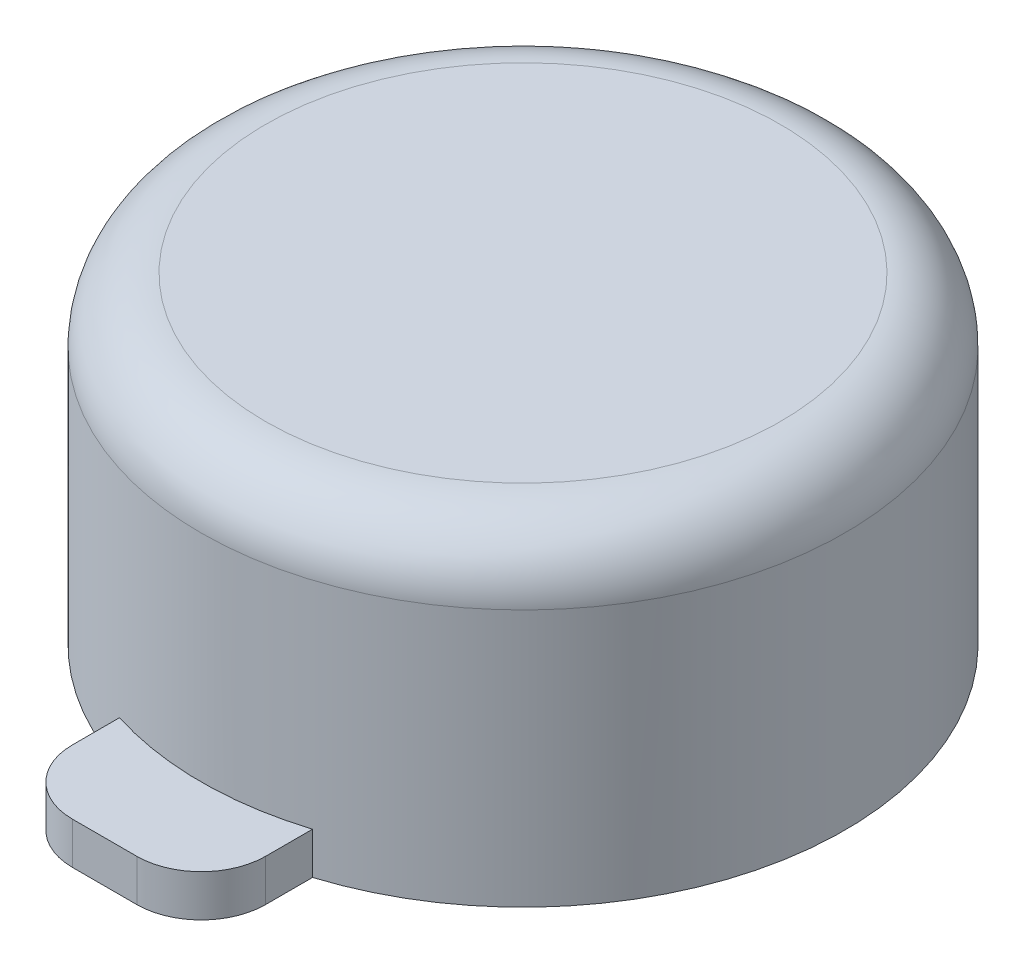
ISO-10303-21;
HEADER;
FILE_DESCRIPTION(('STEP AP214'),'2;1');
FILE_NAME('part.step','',(''),(''),'','','');
FILE_SCHEMA(('AUTOMOTIVE_DESIGN { 1 0 10303 214 1 1 1 1 }'));
ENDSEC;
DATA;
#1=APPLICATION_CONTEXT('core data for automotive mechanical design processes');
#2=APPLICATION_PROTOCOL_DEFINITION('international standard','automotive_design',2000,#1);
#3=PRODUCT_CONTEXT('',#1,'mechanical');
#4=PRODUCT('Part','Part','',(#3));
#5=PRODUCT_RELATED_PRODUCT_CATEGORY('part','',(#4));
#6=PRODUCT_DEFINITION_FORMATION('','',#4);
#7=PRODUCT_DEFINITION_CONTEXT('part definition',#1,'design');
#8=PRODUCT_DEFINITION('design','',#6,#7);
#9=PRODUCT_DEFINITION_SHAPE('','',#8);
#10=(LENGTH_UNIT() NAMED_UNIT(*) SI_UNIT(.MILLI.,.METRE.));
#11=(NAMED_UNIT(*) PLANE_ANGLE_UNIT() SI_UNIT($,.RADIAN.));
#12=(NAMED_UNIT(*) SI_UNIT($,.STERADIAN.) SOLID_ANGLE_UNIT());
#13=UNCERTAINTY_MEASURE_WITH_UNIT(LENGTH_MEASURE(1.E-05),#10,'distance_accuracy_value','');
#14=(GEOMETRIC_REPRESENTATION_CONTEXT(3) GLOBAL_UNCERTAINTY_ASSIGNED_CONTEXT((#13)) GLOBAL_UNIT_ASSIGNED_CONTEXT((#10,
#11,#12)) REPRESENTATION_CONTEXT('',''));
#15=CARTESIAN_POINT('',(0.,0.,0.));
#16=DIRECTION('',(0.,0.,1.));
#17=DIRECTION('',(1.,0.,0.));
#18=AXIS2_PLACEMENT_3D('',#15,#16,#17);
#19=CARTESIAN_POINT('',(0.,12.7,0.));
#20=DIRECTION('',(0.,-1.,0.));
#21=DIRECTION('',(0.,0.,-1.));
#22=AXIS2_PLACEMENT_3D('',#19,#20,#21);
#23=CYLINDRICAL_SURFACE('',#22,12.7);
#24=CARTESIAN_POINT('',(0.,10.16,0.));
#25=DIRECTION('',(0.,1.,0.));
#26=DIRECTION('',(0.,0.,1.));
#27=AXIS2_PLACEMENT_3D('',#24,#25,#26);
#28=CIRCLE('',#27,12.7);
#29=CARTESIAN_POINT('',(0.,10.16,12.7));
#30=VERTEX_POINT('',#29);
#31=EDGE_CURVE('E135',#30,#30,#28,.F.);
#32=ORIENTED_EDGE('',*,*,#31,.T.);
#33=EDGE_LOOP('',(#32));
#34=FACE_BOUND('',#33,.T.);
#35=CARTESIAN_POINT('',(0.,0.,0.));
#36=DIRECTION('',(0.,1.,0.));
#37=DIRECTION('',(0.,0.,1.));
#38=AXIS2_PLACEMENT_3D('',#35,#36,#37);
#39=CIRCLE('',#38,12.7);
#40=CARTESIAN_POINT('',(3.81,0.,12.1150278579952));
#41=VERTEX_POINT('',#40);
#42=CARTESIAN_POINT('',(-3.81,0.,12.1150278579952));
#43=VERTEX_POINT('',#42);
#44=EDGE_CURVE('E94',#41,#43,#39,.T.);
#45=ORIENTED_EDGE('',*,*,#44,.T.);
#46=DIRECTION('',(0.,-1.,0.));
#47=VECTOR('',#46,1.);
#48=CARTESIAN_POINT('',(-3.80999999999999,12.7,12.1150278579952));
#49=LINE('',#48,#47);
#50=CARTESIAN_POINT('',(-3.81,1.651,12.1150278579952));
#51=VERTEX_POINT('',#50);
#52=EDGE_CURVE('E160',#51,#43,#49,.T.);
#53=ORIENTED_EDGE('',*,*,#52,.F.);
#54=CARTESIAN_POINT('',(0.,1.651,0.));
#55=DIRECTION('',(0.,1.,0.));
#56=DIRECTION('',(0.,0.,1.));
#57=AXIS2_PLACEMENT_3D('',#54,#55,#56);
#58=CIRCLE('',#57,12.7);
#59=CARTESIAN_POINT('',(3.81,1.651,12.1150278579952));
#60=VERTEX_POINT('',#59);
#61=EDGE_CURVE('E110',#60,#51,#58,.F.);
#62=ORIENTED_EDGE('',*,*,#61,.F.);
#63=DIRECTION('',(0.,-1.,0.));
#64=VECTOR('',#63,1.);
#65=CARTESIAN_POINT('',(3.81,12.7,12.1150278579952));
#66=LINE('',#65,#64);
#67=EDGE_CURVE('E108',#41,#60,#66,.F.);
#68=ORIENTED_EDGE('',*,*,#67,.F.);
#69=EDGE_LOOP('',(#45,#53,#62,#68));
#70=FACE_BOUND('',#69,.T.);
#71=ADVANCED_FACE('F39',(#34,#70),#23,.T.);
#72=CARTESIAN_POINT('',(0.,12.7,0.));
#73=DIRECTION('',(0.,1.,0.));
#74=DIRECTION('',(0.,0.,1.));
#75=AXIS2_PLACEMENT_3D('',#72,#73,#74);
#76=PLANE('',#75);
#77=CARTESIAN_POINT('',(0.,12.7,0.));
#78=DIRECTION('',(0.,1.,0.));
#79=DIRECTION('',(0.,0.,1.));
#80=AXIS2_PLACEMENT_3D('',#77,#78,#79);
#81=CIRCLE('',#80,10.16);
#82=CARTESIAN_POINT('',(0.,12.7,10.16));
#83=VERTEX_POINT('',#82);
#84=EDGE_CURVE('E104',#83,#83,#81,.T.);
#85=ORIENTED_EDGE('',*,*,#84,.T.);
#86=EDGE_LOOP('',(#85));
#87=FACE_BOUND('',#86,.T.);
#88=ADVANCED_FACE('F170',(#87),#76,.T.);
#89=CARTESIAN_POINT('',(0.,0.,0.));
#90=DIRECTION('',(0.,1.,0.));
#91=DIRECTION('',(0.,0.,1.));
#92=AXIS2_PLACEMENT_3D('',#89,#90,#91);
#93=PLANE('',#92);
#94=CARTESIAN_POINT('',(0.,0.,0.));
#95=DIRECTION('',(0.,1.,0.));
#96=DIRECTION('',(0.,0.,1.));
#97=AXIS2_PLACEMENT_3D('',#94,#95,#96);
#98=CIRCLE('',#97,11.43);
#99=CARTESIAN_POINT('',(0.,0.,-11.43));
#100=VERTEX_POINT('',#99);
#101=EDGE_CURVE('E130',#100,#100,#98,.T.);
#102=ORIENTED_EDGE('',*,*,#101,.T.);
#103=EDGE_LOOP('',(#102));
#104=FACE_BOUND('',#103,.T.);
#105=DIRECTION('',(1.,0.,0.));
#106=VECTOR('',#105,1.);
#107=CARTESIAN_POINT('',(-3.81,0.,16.51));
#108=LINE('',#107,#106);
#109=CARTESIAN_POINT('',(-1.27,0.,16.51));
#110=VERTEX_POINT('',#109);
#111=CARTESIAN_POINT('',(1.27,0.,16.51));
#112=VERTEX_POINT('',#111);
#113=EDGE_CURVE('E117',#110,#112,#108,.T.);
#114=ORIENTED_EDGE('',*,*,#113,.F.);
#115=CARTESIAN_POINT('',(-1.27,0.,13.97));
#116=DIRECTION('',(0.,1.,0.));
#117=DIRECTION('',(0.,0.,1.));
#118=AXIS2_PLACEMENT_3D('',#115,#116,#117);
#119=CIRCLE('',#118,2.54);
#120=CARTESIAN_POINT('',(-3.81,0.,13.97));
#121=VERTEX_POINT('',#120);
#122=EDGE_CURVE('E146',#110,#121,#119,.F.);
#123=ORIENTED_EDGE('',*,*,#122,.T.);
#124=DIRECTION('',(0.,0.,1.));
#125=VECTOR('',#124,1.);
#126=CARTESIAN_POINT('',(-3.81,0.,-12.701));
#127=LINE('',#126,#125);
#128=EDGE_CURVE('E101',#43,#121,#127,.T.);
#129=ORIENTED_EDGE('',*,*,#128,.F.);
#130=ORIENTED_EDGE('',*,*,#44,.F.);
#131=DIRECTION('',(0.,0.,1.));
#132=VECTOR('',#131,1.);
#133=CARTESIAN_POINT('',(3.81,0.,-12.701));
#134=LINE('',#133,#132);
#135=CARTESIAN_POINT('',(3.81,0.,13.97));
#136=VERTEX_POINT('',#135);
#137=EDGE_CURVE('E99',#41,#136,#134,.T.);
#138=ORIENTED_EDGE('',*,*,#137,.T.);
#139=CARTESIAN_POINT('',(1.27,0.,13.97));
#140=DIRECTION('',(0.,1.,0.));
#141=DIRECTION('',(0.,0.,1.));
#142=AXIS2_PLACEMENT_3D('',#139,#140,#141);
#143=CIRCLE('',#142,2.54);
#144=EDGE_CURVE('E144',#136,#112,#143,.F.);
#145=ORIENTED_EDGE('',*,*,#144,.T.);
#146=EDGE_LOOP('',(#114,#123,#129,#130,#138,#145));
#147=FACE_BOUND('',#146,.T.);
#148=ADVANCED_FACE('F97',(#104,#147),#93,.F.);
#149=CARTESIAN_POINT('',(0.,10.16,0.));
#150=DIRECTION('',(0.,1.,0.));
#151=DIRECTION('',(0.,0.,1.));
#152=AXIS2_PLACEMENT_3D('',#149,#150,#151);
#153=TOROIDAL_SURFACE('',#152,10.16,2.54);
#154=ORIENTED_EDGE('',*,*,#31,.F.);
#155=EDGE_LOOP('',(#154));
#156=FACE_BOUND('',#155,.T.);
#157=ORIENTED_EDGE('',*,*,#84,.F.);
#158=EDGE_LOOP('',(#157));
#159=FACE_BOUND('',#158,.T.);
#160=ADVANCED_FACE('F182',(#156,#159),#153,.T.);
#161=CARTESIAN_POINT('',(0.,12.7,0.));
#162=DIRECTION('',(0.,-1.,0.));
#163=DIRECTION('',(0.,0.,-1.));
#164=AXIS2_PLACEMENT_3D('',#161,#162,#163);
#165=CYLINDRICAL_SURFACE('',#164,11.43);
#166=CARTESIAN_POINT('',(0.,10.16,0.));
#167=DIRECTION('',(0.,-1.,0.));
#168=DIRECTION('',(0.,0.,-1.));
#169=AXIS2_PLACEMENT_3D('',#166,#167,#168);
#170=CIRCLE('',#169,11.43);
#171=CARTESIAN_POINT('',(0.,10.16,-11.43));
#172=VERTEX_POINT('',#171);
#173=EDGE_CURVE('E105',#172,#172,#170,.T.);
#174=CARTESIAN_POINT('',(0.,10.16,-11.43));
#175=CARTESIAN_POINT('',(0.,10.0541666666667,-11.43));
#176=CARTESIAN_POINT('',(0.,9.94833333333334,-11.43));
#177=CARTESIAN_POINT('',(0.,9.73666666666667,-11.43));
#178=CARTESIAN_POINT('',(0.,9.63083333333334,-11.43));
#179=CARTESIAN_POINT('',(0.,9.41916666666667,-11.43));
#180=CARTESIAN_POINT('',(0.,9.31333333333334,-11.43));
#181=CARTESIAN_POINT('',(0.,9.10166666666667,-11.43));
#182=CARTESIAN_POINT('',(0.,8.99583333333334,-11.43));
#183=CARTESIAN_POINT('',(0.,8.78416666666667,-11.43));
#184=CARTESIAN_POINT('',(0.,8.67833333333334,-11.43));
#185=CARTESIAN_POINT('',(0.,8.46666666666667,-11.43));
#186=CARTESIAN_POINT('',(0.,8.36083333333334,-11.43));
#187=CARTESIAN_POINT('',(0.,8.14916666666667,-11.43));
#188=CARTESIAN_POINT('',(0.,8.04333333333334,-11.43));
#189=CARTESIAN_POINT('',(0.,7.83166666666667,-11.43));
#190=CARTESIAN_POINT('',(0.,7.72583333333334,-11.43));
#191=CARTESIAN_POINT('',(0.,7.51416666666667,-11.43));
#192=CARTESIAN_POINT('',(0.,7.40833333333334,-11.43));
#193=CARTESIAN_POINT('',(0.,7.19666666666667,-11.43));
#194=CARTESIAN_POINT('',(0.,7.09083333333334,-11.43));
#195=CARTESIAN_POINT('',(0.,6.87916666666667,-11.43));
#196=CARTESIAN_POINT('',(0.,6.77333333333334,-11.43));
#197=CARTESIAN_POINT('',(0.,6.56166666666667,-11.43));
#198=CARTESIAN_POINT('',(0.,6.45583333333334,-11.43));
#199=CARTESIAN_POINT('',(0.,6.24416666666667,-11.43));
#200=CARTESIAN_POINT('',(0.,6.13833333333334,-11.43));
#201=CARTESIAN_POINT('',(0.,5.92666666666667,-11.43));
#202=CARTESIAN_POINT('',(0.,5.82083333333333,-11.43));
#203=CARTESIAN_POINT('',(0.,5.60916666666667,-11.43));
#204=CARTESIAN_POINT('',(0.,5.50333333333333,-11.43));
#205=CARTESIAN_POINT('',(0.,5.29166666666667,-11.43));
#206=CARTESIAN_POINT('',(0.,5.18583333333333,-11.43));
#207=CARTESIAN_POINT('',(0.,4.97416666666667,-11.43));
#208=CARTESIAN_POINT('',(0.,4.86833333333334,-11.43));
#209=CARTESIAN_POINT('',(0.,4.65666666666667,-11.43));
#210=CARTESIAN_POINT('',(0.,4.55083333333334,-11.43));
#211=CARTESIAN_POINT('',(0.,4.33916666666667,-11.43));
#212=CARTESIAN_POINT('',(0.,4.23333333333334,-11.43));
#213=CARTESIAN_POINT('',(0.,4.02166666666667,-11.43));
#214=CARTESIAN_POINT('',(0.,3.91583333333333,-11.43));
#215=CARTESIAN_POINT('',(0.,3.70416666666667,-11.43));
#216=CARTESIAN_POINT('',(0.,3.59833333333333,-11.43));
#217=CARTESIAN_POINT('',(0.,3.38666666666667,-11.43));
#218=CARTESIAN_POINT('',(0.,3.28083333333333,-11.43));
#219=CARTESIAN_POINT('',(0.,3.06916666666667,-11.43));
#220=CARTESIAN_POINT('',(0.,2.96333333333333,-11.43));
#221=CARTESIAN_POINT('',(0.,2.75166666666667,-11.43));
#222=CARTESIAN_POINT('',(0.,2.64583333333333,-11.43));
#223=CARTESIAN_POINT('',(0.,2.43416666666667,-11.43));
#224=CARTESIAN_POINT('',(0.,2.32833333333333,-11.43));
#225=CARTESIAN_POINT('',(0.,2.11666666666667,-11.43));
#226=CARTESIAN_POINT('',(0.,2.01083333333333,-11.43));
#227=CARTESIAN_POINT('',(0.,1.79916666666667,-11.43));
#228=CARTESIAN_POINT('',(0.,1.69333333333333,-11.43));
#229=CARTESIAN_POINT('',(0.,1.48166666666667,-11.43));
#230=CARTESIAN_POINT('',(0.,1.37583333333333,-11.43));
#231=CARTESIAN_POINT('',(0.,1.16416666666667,-11.43));
#232=CARTESIAN_POINT('',(0.,1.05833333333333,-11.43));
#233=CARTESIAN_POINT('',(0.,0.846666666666666,-11.43));
#234=CARTESIAN_POINT('',(0.,0.740833333333333,-11.43));
#235=CARTESIAN_POINT('',(0.,0.529166666666666,-11.43));
#236=CARTESIAN_POINT('',(0.,0.423333333333332,-11.43));
#237=CARTESIAN_POINT('',(0.,0.211666666666666,-11.43));
#238=CARTESIAN_POINT('',(0.,0.105833333333333,-11.43));
#239=CARTESIAN_POINT('',(0.,0.,-11.43));
#240=B_SPLINE_CURVE_WITH_KNOTS('',3,(#174,#175,#176,#177,#178,#179,#180,#181,#182,#183,#184,
#185,#186,#187,#188,#189,#190,#191,#192,#193,#194,#195,#196,#197,#198,#199,#200,#201,#202,#203,
#204,#205,#206,#207,#208,#209,#210,#211,#212,#213,#214,#215,#216,#217,#218,#219,#220,#221,#222,
#223,#224,#225,#226,#227,#228,#229,#230,#231,#232,#233,#234,#235,#236,#237,#238,#239),
.UNSPECIFIED.,.F.,.F.,(4,2,2,2,2,2,2,2,2,2,2,2,2,2,2,2,2,2,2,2,2,2,2,2,2,2,2,2,2,2,2,2,4),(0.,
0.3175,0.635,0.9525,1.27,1.5875,1.905,2.2225,2.54,2.8575,3.175,3.4925,3.81,4.1275,4.445,4.7625,
5.08,5.3975,5.715,6.0325,6.35,6.6675,6.985,7.3025,7.62,7.93750000000001,8.255,8.57250000000001,
8.89,9.2075,9.525,9.84250000000001,10.16),.UNSPECIFIED.);
#241=EDGE_CURVE('BSEAM184',#172,#100,#240,.T.);
#242=ORIENTED_EDGE('',*,*,#173,.F.);
#243=ORIENTED_EDGE('',*,*,#101,.F.);
#244=ORIENTED_EDGE('',*,*,#241,.T.);
#245=ORIENTED_EDGE('',*,*,#241,.F.);
#246=EDGE_LOOP('',(#242,#244,#243,#245));
#247=FACE_BOUND('',#246,.T.);
#248=ADVANCED_FACE('F184',(#247),#165,.F.);
#249=CARTESIAN_POINT('',(0.,11.43,0.));
#250=DIRECTION('',(0.,1.,0.));
#251=DIRECTION('',(0.,0.,1.));
#252=AXIS2_PLACEMENT_3D('',#249,#250,#251);
#253=PLANE('',#252);
#254=CARTESIAN_POINT('',(0.,11.43,0.));
#255=DIRECTION('',(0.,1.,0.));
#256=DIRECTION('',(0.,0.,1.));
#257=AXIS2_PLACEMENT_3D('',#254,#255,#256);
#258=CIRCLE('',#257,10.16);
#259=CARTESIAN_POINT('',(0.,11.43,10.16));
#260=VERTEX_POINT('',#259);
#261=EDGE_CURVE('E127',#260,#260,#258,.T.);
#262=ORIENTED_EDGE('',*,*,#261,.F.);
#263=EDGE_LOOP('',(#262));
#264=FACE_BOUND('',#263,.T.);
#265=ADVANCED_FACE('F189',(#264),#253,.F.);
#266=CARTESIAN_POINT('',(0.,10.16,0.));
#267=DIRECTION('',(0.,1.,0.));
#268=DIRECTION('',(0.,0.,1.));
#269=AXIS2_PLACEMENT_3D('',#266,#267,#268);
#270=TOROIDAL_SURFACE('',#269,10.16,1.27);
#271=ORIENTED_EDGE('',*,*,#173,.T.);
#272=EDGE_LOOP('',(#271));
#273=FACE_BOUND('',#272,.T.);
#274=ORIENTED_EDGE('',*,*,#261,.T.);
#275=EDGE_LOOP('',(#274));
#276=FACE_BOUND('',#275,.T.);
#277=ADVANCED_FACE('F208',(#273,#276),#270,.F.);
#278=CARTESIAN_POINT('',(-3.81,0.,-12.701));
#279=DIRECTION('',(-1.,0.,0.));
#280=DIRECTION('',(0.,-1.,0.));
#281=AXIS2_PLACEMENT_3D('',#278,#279,#280);
#282=PLANE('',#281);
#283=ORIENTED_EDGE('',*,*,#128,.T.);
#284=DIRECTION('',(0.,-1.,0.));
#285=VECTOR('',#284,1.);
#286=CARTESIAN_POINT('',(-3.81,1.651,13.97));
#287=LINE('',#286,#285);
#288=CARTESIAN_POINT('',(-3.81,1.651,13.97));
#289=VERTEX_POINT('',#288);
#290=EDGE_CURVE('E62',#121,#289,#287,.F.);
#291=ORIENTED_EDGE('',*,*,#290,.T.);
#292=DIRECTION('',(0.,0.,1.));
#293=VECTOR('',#292,1.);
#294=CARTESIAN_POINT('',(-3.81,1.651,-12.701));
#295=LINE('',#294,#293);
#296=EDGE_CURVE('E113',#51,#289,#295,.T.);
#297=ORIENTED_EDGE('',*,*,#296,.F.);
#298=ORIENTED_EDGE('',*,*,#52,.T.);
#299=EDGE_LOOP('',(#283,#291,#297,#298));
#300=FACE_BOUND('',#299,.T.);
#301=ADVANCED_FACE('F159',(#300),#282,.T.);
#302=CARTESIAN_POINT('',(-3.81,1.651,-12.701));
#303=DIRECTION('',(0.,1.,0.));
#304=DIRECTION('',(0.,0.,1.));
#305=AXIS2_PLACEMENT_3D('',#302,#303,#304);
#306=PLANE('',#305);
#307=ORIENTED_EDGE('',*,*,#296,.T.);
#308=CARTESIAN_POINT('',(-1.27,1.651,13.97));
#309=DIRECTION('',(0.,1.,0.));
#310=DIRECTION('',(0.,0.,1.));
#311=AXIS2_PLACEMENT_3D('',#308,#309,#310);
#312=CIRCLE('',#311,2.54);
#313=CARTESIAN_POINT('',(-1.27,1.651,16.51));
#314=VERTEX_POINT('',#313);
#315=EDGE_CURVE('E47',#289,#314,#312,.T.);
#316=ORIENTED_EDGE('',*,*,#315,.T.);
#317=DIRECTION('',(-1.,0.,0.));
#318=VECTOR('',#317,1.);
#319=CARTESIAN_POINT('',(-3.81,1.651,16.51));
#320=LINE('',#319,#318);
#321=CARTESIAN_POINT('',(1.27,1.651,16.51));
#322=VERTEX_POINT('',#321);
#323=EDGE_CURVE('E120',#322,#314,#320,.T.);
#324=ORIENTED_EDGE('',*,*,#323,.F.);
#325=CARTESIAN_POINT('',(1.27,1.651,13.97));
#326=DIRECTION('',(0.,1.,0.));
#327=DIRECTION('',(0.,0.,1.));
#328=AXIS2_PLACEMENT_3D('',#325,#326,#327);
#329=CIRCLE('',#328,2.54);
#330=CARTESIAN_POINT('',(3.81,1.651,13.97));
#331=VERTEX_POINT('',#330);
#332=EDGE_CURVE('E54',#322,#331,#329,.T.);
#333=ORIENTED_EDGE('',*,*,#332,.T.);
#334=DIRECTION('',(0.,0.,1.));
#335=VECTOR('',#334,1.);
#336=CARTESIAN_POINT('',(3.81,1.651,-12.701));
#337=LINE('',#336,#335);
#338=EDGE_CURVE('E112',#60,#331,#337,.T.);
#339=ORIENTED_EDGE('',*,*,#338,.F.);
#340=ORIENTED_EDGE('',*,*,#61,.T.);
#341=EDGE_LOOP('',(#307,#316,#324,#333,#339,#340));
#342=FACE_BOUND('',#341,.T.);
#343=ADVANCED_FACE('F151',(#342),#306,.T.);
#344=CARTESIAN_POINT('',(3.81,0.,-12.701));
#345=DIRECTION('',(1.,0.,0.));
#346=DIRECTION('',(0.,1.,0.));
#347=AXIS2_PLACEMENT_3D('',#344,#345,#346);
#348=PLANE('',#347);
#349=ORIENTED_EDGE('',*,*,#338,.T.);
#350=DIRECTION('',(0.,1.,0.));
#351=VECTOR('',#350,1.);
#352=CARTESIAN_POINT('',(3.81,0.,13.97));
#353=LINE('',#352,#351);
#354=EDGE_CURVE('E11',#331,#136,#353,.F.);
#355=ORIENTED_EDGE('',*,*,#354,.T.);
#356=ORIENTED_EDGE('',*,*,#137,.F.);
#357=ORIENTED_EDGE('',*,*,#67,.T.);
#358=EDGE_LOOP('',(#349,#355,#356,#357));
#359=FACE_BOUND('',#358,.T.);
#360=ADVANCED_FACE('F115',(#359),#348,.T.);
#361=CARTESIAN_POINT('',(0.,0.,16.51));
#362=DIRECTION('',(0.,0.,-1.));
#363=DIRECTION('',(-1.,0.,0.));
#364=AXIS2_PLACEMENT_3D('',#361,#362,#363);
#365=PLANE('',#364);
#366=ORIENTED_EDGE('',*,*,#323,.T.);
#367=DIRECTION('',(0.,-1.,0.));
#368=VECTOR('',#367,1.);
#369=CARTESIAN_POINT('',(-1.27,0.,16.51));
#370=LINE('',#369,#368);
#371=EDGE_CURVE('E141',#314,#110,#370,.T.);
#372=ORIENTED_EDGE('',*,*,#371,.T.);
#373=ORIENTED_EDGE('',*,*,#113,.T.);
#374=DIRECTION('',(0.,1.,0.));
#375=VECTOR('',#374,1.);
#376=CARTESIAN_POINT('',(1.27,1.651,16.51));
#377=LINE('',#376,#375);
#378=EDGE_CURVE('E138',#112,#322,#377,.T.);
#379=ORIENTED_EDGE('',*,*,#378,.T.);
#380=EDGE_LOOP('',(#366,#372,#373,#379));
#381=FACE_BOUND('',#380,.T.);
#382=ADVANCED_FACE('F155',(#381),#365,.F.);
#383=CARTESIAN_POINT('',(-1.27,0.,13.97));
#384=DIRECTION('',(0.,1.,0.));
#385=DIRECTION('',(-1.,0.,0.));
#386=AXIS2_PLACEMENT_3D('',#383,#384,#385);
#387=CYLINDRICAL_SURFACE('',#386,2.54);
#388=ORIENTED_EDGE('',*,*,#315,.F.);
#389=ORIENTED_EDGE('',*,*,#290,.F.);
#390=ORIENTED_EDGE('',*,*,#122,.F.);
#391=ORIENTED_EDGE('',*,*,#371,.F.);
#392=EDGE_LOOP('',(#388,#389,#390,#391));
#393=FACE_BOUND('',#392,.T.);
#394=ADVANCED_FACE('F158',(#393),#387,.T.);
#395=CARTESIAN_POINT('',(1.27,0.,13.97));
#396=DIRECTION('',(0.,-1.,0.));
#397=DIRECTION('',(1.,0.,0.));
#398=AXIS2_PLACEMENT_3D('',#395,#396,#397);
#399=CYLINDRICAL_SURFACE('',#398,2.54);
#400=ORIENTED_EDGE('',*,*,#144,.F.);
#401=ORIENTED_EDGE('',*,*,#354,.F.);
#402=ORIENTED_EDGE('',*,*,#332,.F.);
#403=ORIENTED_EDGE('',*,*,#378,.F.);
#404=EDGE_LOOP('',(#400,#401,#402,#403));
#405=FACE_BOUND('',#404,.T.);
#406=ADVANCED_FACE('F41',(#405),#399,.T.);
#407=CLOSED_SHELL('',(#71,#88,#148,#160,#248,#265,#277,#301,#343,#360,#382,#394,#406));
#408=MANIFOLD_SOLID_BREP('B2',#407);
#409=ADVANCED_BREP_SHAPE_REPRESENTATION('',(#18,#408),#14);
#410=SHAPE_DEFINITION_REPRESENTATION(#9,#409);
ENDSEC;
END-ISO-10303-21;
